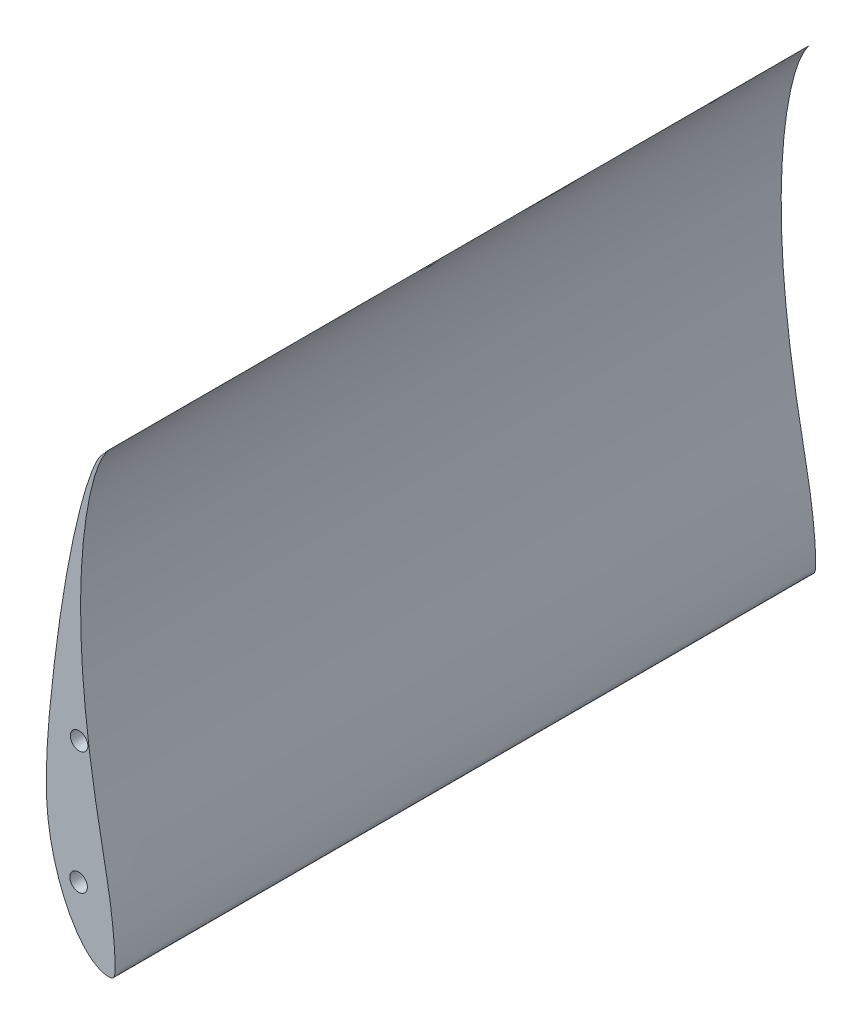
ISO-10303-21;
HEADER;
FILE_DESCRIPTION(('STEP AP214'),'2;1');
FILE_NAME('part.step','',(''),(''),'','','');
FILE_SCHEMA(('AUTOMOTIVE_DESIGN { 1 0 10303 214 1 1 1 1 }'));
ENDSEC;
DATA;
#1=APPLICATION_CONTEXT('core data for automotive mechanical design processes');
#2=APPLICATION_PROTOCOL_DEFINITION('international standard','automotive_design',2000,#1);
#3=PRODUCT_CONTEXT('',#1,'mechanical');
#4=PRODUCT('Part','Part','',(#3));
#5=PRODUCT_RELATED_PRODUCT_CATEGORY('part','',(#4));
#6=PRODUCT_DEFINITION_FORMATION('','',#4);
#7=PRODUCT_DEFINITION_CONTEXT('part definition',#1,'design');
#8=PRODUCT_DEFINITION('design','',#6,#7);
#9=PRODUCT_DEFINITION_SHAPE('','',#8);
#10=(LENGTH_UNIT() NAMED_UNIT(*) SI_UNIT(.MILLI.,.METRE.));
#11=(NAMED_UNIT(*) PLANE_ANGLE_UNIT() SI_UNIT($,.RADIAN.));
#12=(NAMED_UNIT(*) SI_UNIT($,.STERADIAN.) SOLID_ANGLE_UNIT());
#13=UNCERTAINTY_MEASURE_WITH_UNIT(LENGTH_MEASURE(1.E-05),#10,'distance_accuracy_value','');
#14=(GEOMETRIC_REPRESENTATION_CONTEXT(3) GLOBAL_UNCERTAINTY_ASSIGNED_CONTEXT((#13)) GLOBAL_UNIT_ASSIGNED_CONTEXT((#10,
#11,#12)) REPRESENTATION_CONTEXT('',''));
#15=CARTESIAN_POINT('',(0.,0.,0.));
#16=DIRECTION('',(0.,0.,1.));
#17=DIRECTION('',(1.,0.,0.));
#18=AXIS2_PLACEMENT_3D('',#15,#16,#17);
#19=CARTESIAN_POINT('',(9.83220064090969,-128.533249445773,400.));
#20=DIRECTION('',(0.,0.,-1.));
#21=DIRECTION('',(-1.,0.,0.));
#22=AXIS2_PLACEMENT_3D('',#19,#20,#21);
#23=PLANE('',#22);
#24=CARTESIAN_POINT('',(15.5178766468765,129.912518558111,400.));
#25=CARTESIAN_POINT('',(15.5112577760927,129.914075077235,400.));
#26=CARTESIAN_POINT('',(14.874436484129,129.059359543432,400.));
#27=CARTESIAN_POINT('',(14.1651933414142,128.336507435737,400.));
#28=CARTESIAN_POINT('',(12.6837993664146,126.731483760943,400.));
#29=CARTESIAN_POINT('',(11.1078794452725,124.837931087524,400.));
#30=CARTESIAN_POINT('',(9.51917682137463,122.247713672732,400.));
#31=CARTESIAN_POINT('',(7.97954437551885,119.026758629898,400.));
#32=CARTESIAN_POINT('',(6.3727514322999,115.138307858436,400.));
#33=CARTESIAN_POINT('',(4.72117109532029,110.588288498786,400.));
#34=CARTESIAN_POINT('',(3.03647055346109,105.397927749772,400.));
#35=CARTESIAN_POINT('',(1.33327702292451,99.5941705850828,400.));
#36=CARTESIAN_POINT('',(-0.380415523956932,93.2095164269682,400.));
#37=CARTESIAN_POINT('',(-2.08887211647572,86.279218576663,400.));
#38=CARTESIAN_POINT('',(-3.77972531922754,78.8430102404263,400.));
#39=CARTESIAN_POINT('',(-5.44241407442938,70.9452130530808,400.));
#40=CARTESIAN_POINT('',(-7.06839089126344,62.6340546275179,400.));
#41=CARTESIAN_POINT('',(-8.63764716524303,53.9581099530436,400.));
#42=CARTESIAN_POINT('',(-10.1479408786302,44.9720130844849,400.));
#43=CARTESIAN_POINT('',(-11.5798240963054,35.7275516141011,400.));
#44=CARTESIAN_POINT('',(-12.9360928504202,26.2845097135994,400.));
#45=CARTESIAN_POINT('',(-14.2059993876318,16.7034060096567,400.));
#46=CARTESIAN_POINT('',(-15.3854800765583,7.05363648075791,400.));
#47=CARTESIAN_POINT('',(-16.4828862799522,-2.58765628515503,400.));
#48=CARTESIAN_POINT('',(-17.470527604772,-12.1406567436327,400.));
#49=CARTESIAN_POINT('',(-18.3299192209294,-21.5275380626841,400.));
#50=CARTESIAN_POINT('',(-19.0126898746145,-30.6822805910019,400.));
#51=CARTESIAN_POINT('',(-19.4823484541266,-39.5525890778018,400.));
#52=CARTESIAN_POINT('',(-19.6851689117001,-48.0891150975566,400.));
#53=CARTESIAN_POINT('',(-19.6635799990772,-56.2481272412426,400.));
#54=CARTESIAN_POINT('',(-19.2640909090026,-64.0144057949797,400.));
#55=CARTESIAN_POINT('',(-18.4545442641922,-71.3909592027682,400.));
#56=CARTESIAN_POINT('',(-17.3098333031931,-78.4078157632564,400.));
#57=CARTESIAN_POINT('',(-15.8268703586684,-85.0666690009488,400.));
#58=CARTESIAN_POINT('',(-14.087889443688,-91.360677915278,400.));
#59=CARTESIAN_POINT('',(-12.1236905727697,-97.2632117768608,400.));
#60=CARTESIAN_POINT('',(-9.98020660719837,-102.749167653507,400.));
#61=CARTESIAN_POINT('',(-7.66892154661113,-107.78445517287,400.));
#62=CARTESIAN_POINT('',(-5.23676112683811,-112.352926407112,400.));
#63=CARTESIAN_POINT('',(-2.71138371010313,-116.429727371661,400.));
#64=CARTESIAN_POINT('',(-0.127010350722333,-119.989292026237,400.));
#65=CARTESIAN_POINT('',(2.46158003032024,-123.030151697899,400.));
#66=CARTESIAN_POINT('',(5.08264384234996,-125.508208578647,400.));
#67=CARTESIAN_POINT('',(7.71348261645666,-127.411672344246,400.));
#68=CARTESIAN_POINT('',(10.2729383804499,-128.817713087278,400.));
#69=CARTESIAN_POINT('',(12.7030203653744,-129.718836404744,400.));
#70=CARTESIAN_POINT('',(14.9459853023923,-130.148221709198,400.));
#71=CARTESIAN_POINT('',(16.843001996817,-130.06533872496,400.));
#72=CARTESIAN_POINT('',(18.5828719827709,-129.576944380391,400.));
#73=CARTESIAN_POINT('',(19.4465561897872,-127.761504397213,400.));
#74=CARTESIAN_POINT('',(19.5677283639575,-125.320621501883,400.));
#75=CARTESIAN_POINT('',(19.6851689117001,-121.981502801355,400.));
#76=CARTESIAN_POINT('',(19.504091563633,-117.782325375171,400.));
#77=CARTESIAN_POINT('',(19.1713265806496,-112.770548223091,400.));
#78=CARTESIAN_POINT('',(18.6383092365071,-107.001947193297,400.));
#79=CARTESIAN_POINT('',(17.9171138523198,-100.535551060257,400.));
#80=CARTESIAN_POINT('',(16.9922648761391,-93.4028916706323,400.));
#81=CARTESIAN_POINT('',(15.6996508187521,-85.6074546498414,400.));
#82=CARTESIAN_POINT('',(14.0787337436467,-77.1112846838087,400.));
#83=CARTESIAN_POINT('',(12.3146587172521,-67.8719066416974,400.));
#84=CARTESIAN_POINT('',(10.4520483986614,-57.9344818495093,400.));
#85=CARTESIAN_POINT('',(8.56821379673431,-47.3614277864138,400.));
#86=CARTESIAN_POINT('',(6.73385301477044,-36.2303933398698,400.));
#87=CARTESIAN_POINT('',(5.01022015947101,-24.6277338485454,400.));
#88=CARTESIAN_POINT('',(3.46054428387239,-12.6534404970173,400.));
#89=CARTESIAN_POINT('',(2.12994821006926,-0.415194752261566,400.));
#90=CARTESIAN_POINT('',(1.07816680141657,11.971397295862,400.));
#91=CARTESIAN_POINT('',(0.332583472926955,24.3820331435514,400.));
#92=CARTESIAN_POINT('',(-0.0773049806772098,36.6870535038775,400.));
#93=CARTESIAN_POINT('',(-0.12907682923869,48.7529704990197,400.));
#94=CARTESIAN_POINT('',(0.180785582651581,60.4451699275156,400.));
#95=CARTESIAN_POINT('',(0.845028315550193,71.6297691793407,400.));
#96=CARTESIAN_POINT('',(1.8550808494795,82.1722750321494,400.));
#97=CARTESIAN_POINT('',(3.17217243151857,91.9471726415022,400.));
#98=CARTESIAN_POINT('',(4.75808602847203,100.827195970681,400.));
#99=CARTESIAN_POINT('',(6.55970742863016,108.708230678244,400.));
#100=CARTESIAN_POINT('',(8.48752258893113,115.445032914632,400.));
#101=CARTESIAN_POINT('',(10.5450533569095,120.958410782661,400.));
#102=CARTESIAN_POINT('',(12.4279574257403,124.892063969133,400.));
#103=CARTESIAN_POINT('',(14.1689537731905,127.792241451864,400.));
#104=CARTESIAN_POINT('',(14.84269063945,128.906364928803,400.));
#105=CARTESIAN_POINT('',(15.524630078705,129.910930395094,400.));
#106=CARTESIAN_POINT('',(15.5178766468765,129.912518558111,400.));
#107=B_SPLINE_CURVE_WITH_KNOTS('',3,(#24,#25,#26,#27,#28,#29,#30,#31,#32,#33,#34,#35,#36,#37,
#38,#39,#40,#41,#42,#43,#44,#45,#46,#47,#48,#49,#50,#51,#52,#53,#54,#55,#56,#57,#58,#59,#60,#61,
#62,#63,#64,#65,#66,#67,#68,#69,#70,#71,#72,#73,#74,#75,#76,#77,#78,#79,#80,#81,#82,#83,#84,#85,
#86,#87,#88,#89,#90,#91,#92,#93,#94,#95,#96,#97,#98,#99,#100,#101,#102,#103,#104,#105,#106),
.UNSPECIFIED.,.T.,.F.,(4,1,1,1,1,1,1,1,1,1,1,1,1,1,1,1,1,1,1,1,1,1,1,1,1,1,1,1,1,1,1,1,1,1,1,1,
1,1,1,1,1,1,1,1,1,1,1,1,1,1,1,1,1,1,1,1,1,1,1,1,1,1,1,1,1,1,1,1,1,1,1,1,1,1,1,1,1,1,1,1,4),(0.,
0.000979677557134172,0.00364886216776309,0.0074834985194781,0.0120952771855933,
0.0175255907768788,0.0240517799938711,0.0317830505527587,0.0406778280832618,0.050710300790478,
0.0618332290621795,0.0739892504845854,0.0871181731906812,0.101145048769791,0.115990637111827,
0.131570421640589,0.147788379302961,0.164550916882416,0.181757895150531,0.199311954944345,
0.217095071712264,0.234990228463986,0.252856883122009,0.270540593729572,0.287886779266045,
0.304773437599674,0.321101419214061,0.336806063174811,0.351800032584037,0.366031063392082,
0.379615674919835,0.392652962879186,0.405170358707495,0.417171919049936,0.428603516911185,
0.43941895910826,0.449596586064162,0.459102079103161,0.467907877534646,0.475988300736527,
0.483308968746149,0.489874507816402,0.495803249719208,0.501149411695553,0.50590307325604,
0.510046768536663,0.513579310681042,0.516446926626751,0.5193500525909,0.523823355179486,
0.529973793997694,0.537715654387927,0.546967844488146,0.55763736682571,0.569620481096633,
0.582804124215616,0.597246960791632,0.613135036654701,0.630443600329816,0.649056123608545,
0.668822256795696,0.689594964002684,0.711189650864602,0.733426688964389,0.756094117504156,
0.778988553684861,0.801889682684954,0.824566597829707,0.846792284880411,0.868338290507787,
0.888978162959066,0.908492011340558,0.926658767581932,0.943286193042322,0.958169210358794,
0.971135821634751,0.981955623079976,0.990251791025976,0.995852565249962,0.999000405686701,1.),.UNSPECIFIED.);
#108=CARTESIAN_POINT('',(15.5178766468765,129.912518558111,400.));
#109=VERTEX_POINT('',#108);
#110=EDGE_CURVE('E10',#109,#109,#107,.T.);
#111=ORIENTED_EDGE('',*,*,#110,.T.);
#112=EDGE_LOOP('',(#111));
#113=FACE_BOUND('',#112,.T.);
#114=CARTESIAN_POINT('',(-1.2229896296439,-91.8555884969206,400.));
#115=DIRECTION('',(0.,0.,1.));
#116=DIRECTION('',(1.,0.,0.));
#117=AXIS2_PLACEMENT_3D('',#114,#115,#116);
#118=CIRCLE('',#117,5.00000000000773);
#119=CARTESIAN_POINT('',(3.77701037036383,-91.8555884969206,400.));
#120=VERTEX_POINT('',#119);
#121=EDGE_CURVE('E52',#120,#120,#118,.T.);
#122=ORIENTED_EDGE('',*,*,#121,.F.);
#123=EDGE_LOOP('',(#122));
#124=FACE_BOUND('',#123,.T.);
#125=CARTESIAN_POINT('',(-0.931130188596623,-21.8555884969207,400.));
#126=DIRECTION('',(0.,0.,1.));
#127=DIRECTION('',(1.,0.,0.));
#128=AXIS2_PLACEMENT_3D('',#125,#126,#127);
#129=CIRCLE('',#128,5.00000000000774);
#130=CARTESIAN_POINT('',(4.06886981141111,-21.8555884969207,400.));
#131=VERTEX_POINT('',#130);
#132=EDGE_CURVE('E64',#131,#131,#129,.T.);
#133=ORIENTED_EDGE('',*,*,#132,.F.);
#134=EDGE_LOOP('',(#133));
#135=FACE_BOUND('',#134,.T.);
#136=ADVANCED_FACE('F37',(#113,#124,#135),#23,.F.);
#137=CARTESIAN_POINT('',(9.83220064090969,-128.533249445773,0.));
#138=DIRECTION('',(0.,0.,-1.));
#139=DIRECTION('',(-1.,0.,0.));
#140=AXIS2_PLACEMENT_3D('',#137,#138,#139);
#141=PLANE('',#140);
#142=CARTESIAN_POINT('',(-1.2229896296439,-91.8555884969206,0.));
#143=DIRECTION('',(0.,0.,1.));
#144=DIRECTION('',(1.,0.,0.));
#145=AXIS2_PLACEMENT_3D('',#142,#143,#144);
#146=CIRCLE('',#145,5.00000000000773);
#147=CARTESIAN_POINT('',(3.77701037036383,-91.8555884969206,0.));
#148=VERTEX_POINT('',#147);
#149=EDGE_CURVE('E57',#148,#148,#146,.T.);
#150=ORIENTED_EDGE('',*,*,#149,.T.);
#151=EDGE_LOOP('',(#150));
#152=FACE_BOUND('',#151,.T.);
#153=CARTESIAN_POINT('',(15.5178766468765,129.912518558111,0.));
#154=CARTESIAN_POINT('',(15.5112577760927,129.914075077235,0.));
#155=CARTESIAN_POINT('',(14.874436484129,129.059359543432,0.));
#156=CARTESIAN_POINT('',(14.1651933414142,128.336507435737,0.));
#157=CARTESIAN_POINT('',(12.6837993664146,126.731483760943,0.));
#158=CARTESIAN_POINT('',(11.1078794452725,124.837931087524,0.));
#159=CARTESIAN_POINT('',(9.51917682137463,122.247713672732,0.));
#160=CARTESIAN_POINT('',(7.97954437551885,119.026758629898,0.));
#161=CARTESIAN_POINT('',(6.3727514322999,115.138307858436,0.));
#162=CARTESIAN_POINT('',(4.72117109532029,110.588288498786,0.));
#163=CARTESIAN_POINT('',(3.03647055346109,105.397927749772,0.));
#164=CARTESIAN_POINT('',(1.33327702292451,99.5941705850828,0.));
#165=CARTESIAN_POINT('',(-0.380415523956932,93.2095164269682,0.));
#166=CARTESIAN_POINT('',(-2.08887211647572,86.279218576663,0.));
#167=CARTESIAN_POINT('',(-3.77972531922754,78.8430102404263,0.));
#168=CARTESIAN_POINT('',(-5.44241407442938,70.9452130530808,0.));
#169=CARTESIAN_POINT('',(-7.06839089126344,62.6340546275179,0.));
#170=CARTESIAN_POINT('',(-8.63764716524303,53.9581099530436,0.));
#171=CARTESIAN_POINT('',(-10.1479408786302,44.9720130844849,0.));
#172=CARTESIAN_POINT('',(-11.5798240963054,35.7275516141011,0.));
#173=CARTESIAN_POINT('',(-12.9360928504202,26.2845097135994,0.));
#174=CARTESIAN_POINT('',(-14.2059993876318,16.7034060096567,0.));
#175=CARTESIAN_POINT('',(-15.3854800765583,7.05363648075791,0.));
#176=CARTESIAN_POINT('',(-16.4828862799522,-2.58765628515503,0.));
#177=CARTESIAN_POINT('',(-17.470527604772,-12.1406567436327,0.));
#178=CARTESIAN_POINT('',(-18.3299192209294,-21.5275380626841,0.));
#179=CARTESIAN_POINT('',(-19.0126898746145,-30.6822805910019,0.));
#180=CARTESIAN_POINT('',(-19.4823484541266,-39.5525890778018,0.));
#181=CARTESIAN_POINT('',(-19.6851689117001,-48.0891150975566,0.));
#182=CARTESIAN_POINT('',(-19.6635799990772,-56.2481272412426,0.));
#183=CARTESIAN_POINT('',(-19.2640909090026,-64.0144057949797,0.));
#184=CARTESIAN_POINT('',(-18.4545442641922,-71.3909592027682,0.));
#185=CARTESIAN_POINT('',(-17.3098333031931,-78.4078157632564,0.));
#186=CARTESIAN_POINT('',(-15.8268703586684,-85.0666690009488,0.));
#187=CARTESIAN_POINT('',(-14.087889443688,-91.360677915278,0.));
#188=CARTESIAN_POINT('',(-12.1236905727697,-97.2632117768608,0.));
#189=CARTESIAN_POINT('',(-9.98020660719837,-102.749167653507,0.));
#190=CARTESIAN_POINT('',(-7.66892154661113,-107.78445517287,0.));
#191=CARTESIAN_POINT('',(-5.23676112683811,-112.352926407112,0.));
#192=CARTESIAN_POINT('',(-2.71138371010313,-116.429727371661,0.));
#193=CARTESIAN_POINT('',(-0.127010350722333,-119.989292026237,0.));
#194=CARTESIAN_POINT('',(2.46158003032024,-123.030151697899,0.));
#195=CARTESIAN_POINT('',(5.08264384234996,-125.508208578647,0.));
#196=CARTESIAN_POINT('',(7.71348261645666,-127.411672344246,0.));
#197=CARTESIAN_POINT('',(10.2729383804499,-128.817713087278,0.));
#198=CARTESIAN_POINT('',(12.7030203653744,-129.718836404744,0.));
#199=CARTESIAN_POINT('',(14.9459853023923,-130.148221709198,0.));
#200=CARTESIAN_POINT('',(16.843001996817,-130.06533872496,0.));
#201=CARTESIAN_POINT('',(18.5828719827709,-129.576944380391,0.));
#202=CARTESIAN_POINT('',(19.4465561897872,-127.761504397213,0.));
#203=CARTESIAN_POINT('',(19.5677283639575,-125.320621501883,0.));
#204=CARTESIAN_POINT('',(19.6851689117001,-121.981502801355,0.));
#205=CARTESIAN_POINT('',(19.504091563633,-117.782325375171,0.));
#206=CARTESIAN_POINT('',(19.1713265806496,-112.770548223091,0.));
#207=CARTESIAN_POINT('',(18.6383092365071,-107.001947193297,0.));
#208=CARTESIAN_POINT('',(17.9171138523198,-100.535551060257,0.));
#209=CARTESIAN_POINT('',(16.9922648761391,-93.4028916706323,0.));
#210=CARTESIAN_POINT('',(15.6996508187521,-85.6074546498414,0.));
#211=CARTESIAN_POINT('',(14.0787337436467,-77.1112846838087,0.));
#212=CARTESIAN_POINT('',(12.3146587172521,-67.8719066416974,0.));
#213=CARTESIAN_POINT('',(10.4520483986614,-57.9344818495093,0.));
#214=CARTESIAN_POINT('',(8.56821379673431,-47.3614277864138,0.));
#215=CARTESIAN_POINT('',(6.73385301477044,-36.2303933398698,0.));
#216=CARTESIAN_POINT('',(5.01022015947101,-24.6277338485454,0.));
#217=CARTESIAN_POINT('',(3.46054428387239,-12.6534404970173,0.));
#218=CARTESIAN_POINT('',(2.12994821006926,-0.415194752261566,0.));
#219=CARTESIAN_POINT('',(1.07816680141657,11.971397295862,0.));
#220=CARTESIAN_POINT('',(0.332583472926955,24.3820331435514,0.));
#221=CARTESIAN_POINT('',(-0.0773049806772098,36.6870535038775,0.));
#222=CARTESIAN_POINT('',(-0.12907682923869,48.7529704990197,0.));
#223=CARTESIAN_POINT('',(0.180785582651581,60.4451699275156,0.));
#224=CARTESIAN_POINT('',(0.845028315550193,71.6297691793407,0.));
#225=CARTESIAN_POINT('',(1.8550808494795,82.1722750321494,0.));
#226=CARTESIAN_POINT('',(3.17217243151857,91.9471726415022,0.));
#227=CARTESIAN_POINT('',(4.75808602847203,100.827195970681,0.));
#228=CARTESIAN_POINT('',(6.55970742863016,108.708230678244,0.));
#229=CARTESIAN_POINT('',(8.48752258893113,115.445032914632,0.));
#230=CARTESIAN_POINT('',(10.5450533569095,120.958410782661,0.));
#231=CARTESIAN_POINT('',(12.4279574257403,124.892063969133,0.));
#232=CARTESIAN_POINT('',(14.1689537731905,127.792241451864,0.));
#233=CARTESIAN_POINT('',(14.84269063945,128.906364928803,0.));
#234=CARTESIAN_POINT('',(15.524630078705,129.910930395094,0.));
#235=CARTESIAN_POINT('',(15.5178766468765,129.912518558111,0.));
#236=B_SPLINE_CURVE_WITH_KNOTS('',3,(#153,#154,#155,#156,#157,#158,#159,#160,#161,#162,#163,
#164,#165,#166,#167,#168,#169,#170,#171,#172,#173,#174,#175,#176,#177,#178,#179,#180,#181,#182,
#183,#184,#185,#186,#187,#188,#189,#190,#191,#192,#193,#194,#195,#196,#197,#198,#199,#200,#201,
#202,#203,#204,#205,#206,#207,#208,#209,#210,#211,#212,#213,#214,#215,#216,#217,#218,#219,#220,
#221,#222,#223,#224,#225,#226,#227,#228,#229,#230,#231,#232,#233,#234,#235),.UNSPECIFIED.,.T.,
.F.,(4,1,1,1,1,1,1,1,1,1,1,1,1,1,1,1,1,1,1,1,1,1,1,1,1,1,1,1,1,1,1,1,1,1,1,1,1,1,1,1,1,1,1,1,1,
1,1,1,1,1,1,1,1,1,1,1,1,1,1,1,1,1,1,1,1,1,1,1,1,1,1,1,1,1,1,1,1,1,1,1,4),(0.,
0.000979677557134172,0.00364886216776309,0.0074834985194781,0.0120952771855933,
0.0175255907768788,0.0240517799938711,0.0317830505527587,0.0406778280832618,0.050710300790478,
0.0618332290621795,0.0739892504845854,0.0871181731906812,0.101145048769791,0.115990637111827,
0.131570421640589,0.147788379302961,0.164550916882416,0.181757895150531,0.199311954944345,
0.217095071712264,0.234990228463986,0.252856883122009,0.270540593729572,0.287886779266045,
0.304773437599674,0.321101419214061,0.336806063174811,0.351800032584037,0.366031063392082,
0.379615674919835,0.392652962879186,0.405170358707495,0.417171919049936,0.428603516911185,
0.43941895910826,0.449596586064162,0.459102079103161,0.467907877534646,0.475988300736527,
0.483308968746149,0.489874507816402,0.495803249719208,0.501149411695553,0.50590307325604,
0.510046768536663,0.513579310681042,0.516446926626751,0.5193500525909,0.523823355179486,
0.529973793997694,0.537715654387927,0.546967844488146,0.55763736682571,0.569620481096633,
0.582804124215616,0.597246960791632,0.613135036654701,0.630443600329816,0.649056123608545,
0.668822256795696,0.689594964002684,0.711189650864602,0.733426688964389,0.756094117504156,
0.778988553684861,0.801889682684954,0.824566597829707,0.846792284880411,0.868338290507787,
0.888978162959066,0.908492011340558,0.926658767581932,0.943286193042322,0.958169210358794,
0.971135821634751,0.981955623079976,0.990251791025976,0.995852565249962,0.999000405686701,1.),.UNSPECIFIED.);
#237=CARTESIAN_POINT('',(15.5178766468765,129.912518558111,0.));
#238=VERTEX_POINT('',#237);
#239=EDGE_CURVE('E42',#238,#238,#236,.T.);
#240=ORIENTED_EDGE('',*,*,#239,.F.);
#241=EDGE_LOOP('',(#240));
#242=FACE_BOUND('',#241,.T.);
#243=CARTESIAN_POINT('',(-0.931130188596623,-21.8555884969207,0.));
#244=DIRECTION('',(0.,0.,1.));
#245=DIRECTION('',(1.,0.,0.));
#246=AXIS2_PLACEMENT_3D('',#243,#244,#245);
#247=CIRCLE('',#246,5.00000000000774);
#248=CARTESIAN_POINT('',(4.06886981141111,-21.8555884969207,0.));
#249=VERTEX_POINT('',#248);
#250=EDGE_CURVE('E68',#249,#249,#247,.T.);
#251=ORIENTED_EDGE('',*,*,#250,.T.);
#252=EDGE_LOOP('',(#251));
#253=FACE_BOUND('',#252,.T.);
#254=ADVANCED_FACE('F80',(#152,#242,#253),#141,.T.);
#255=DIRECTION('',(0.,0.,-1.));
#256=VECTOR('',#255,1.);
#257=SURFACE_OF_LINEAR_EXTRUSION('',#107,#256);
#258=ORIENTED_EDGE('',*,*,#110,.F.);
#259=EDGE_LOOP('',(#258));
#260=FACE_BOUND('',#259,.T.);
#261=ORIENTED_EDGE('',*,*,#239,.T.);
#262=EDGE_LOOP('',(#261));
#263=FACE_BOUND('',#262,.T.);
#264=ADVANCED_FACE('F39',(#260,#263),#257,.F.);
#265=CARTESIAN_POINT('',(-1.2229896296439,-91.8555884969206,400.));
#266=DIRECTION('',(0.,0.,-1.));
#267=DIRECTION('',(-1.,0.,0.));
#268=AXIS2_PLACEMENT_3D('',#265,#266,#267);
#269=CYLINDRICAL_SURFACE('',#268,5.00000000000773);
#270=ORIENTED_EDGE('',*,*,#121,.T.);
#271=EDGE_LOOP('',(#270));
#272=FACE_BOUND('',#271,.T.);
#273=ORIENTED_EDGE('',*,*,#149,.F.);
#274=EDGE_LOOP('',(#273));
#275=FACE_BOUND('',#274,.T.);
#276=ADVANCED_FACE('F88',(#272,#275),#269,.F.);
#277=CARTESIAN_POINT('',(-0.931130188596623,-21.8555884969207,400.));
#278=DIRECTION('',(0.,0.,-1.));
#279=DIRECTION('',(-1.,0.,0.));
#280=AXIS2_PLACEMENT_3D('',#277,#278,#279);
#281=CYLINDRICAL_SURFACE('',#280,5.00000000000774);
#282=ORIENTED_EDGE('',*,*,#132,.T.);
#283=EDGE_LOOP('',(#282));
#284=FACE_BOUND('',#283,.T.);
#285=ORIENTED_EDGE('',*,*,#250,.F.);
#286=EDGE_LOOP('',(#285));
#287=FACE_BOUND('',#286,.T.);
#288=ADVANCED_FACE('F76',(#284,#287),#281,.F.);
#289=CLOSED_SHELL('',(#136,#254,#264,#276,#288));
#290=MANIFOLD_SOLID_BREP('B2',#289);
#291=ADVANCED_BREP_SHAPE_REPRESENTATION('',(#18,#290),#14);
#292=SHAPE_DEFINITION_REPRESENTATION(#9,#291);
ENDSEC;
END-ISO-10303-21;
